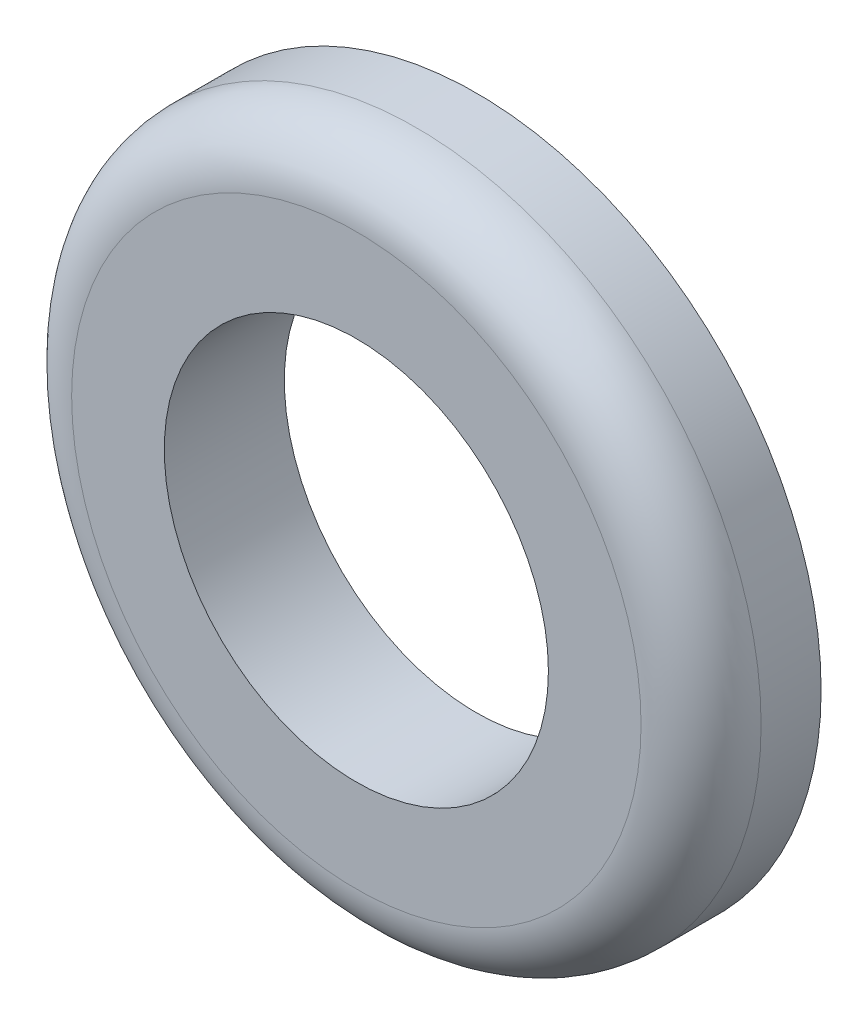
ISO-10303-21;
HEADER;
FILE_DESCRIPTION(('STEP AP214'),'2;1');
FILE_NAME('part.step','',(''),(''),'','','');
FILE_SCHEMA(('AUTOMOTIVE_DESIGN { 1 0 10303 214 1 1 1 1 }'));
ENDSEC;
DATA;
#1=APPLICATION_CONTEXT('core data for automotive mechanical design processes');
#2=APPLICATION_PROTOCOL_DEFINITION('international standard','automotive_design',2000,#1);
#3=PRODUCT_CONTEXT('',#1,'mechanical');
#4=PRODUCT('Part','Part','',(#3));
#5=PRODUCT_RELATED_PRODUCT_CATEGORY('part','',(#4));
#6=PRODUCT_DEFINITION_FORMATION('','',#4);
#7=PRODUCT_DEFINITION_CONTEXT('part definition',#1,'design');
#8=PRODUCT_DEFINITION('design','',#6,#7);
#9=PRODUCT_DEFINITION_SHAPE('','',#8);
#10=(LENGTH_UNIT() NAMED_UNIT(*) SI_UNIT(.MILLI.,.METRE.));
#11=(NAMED_UNIT(*) PLANE_ANGLE_UNIT() SI_UNIT($,.RADIAN.));
#12=(NAMED_UNIT(*) SI_UNIT($,.STERADIAN.) SOLID_ANGLE_UNIT());
#13=UNCERTAINTY_MEASURE_WITH_UNIT(LENGTH_MEASURE(1.E-05),#10,'distance_accuracy_value','');
#14=(GEOMETRIC_REPRESENTATION_CONTEXT(3) GLOBAL_UNCERTAINTY_ASSIGNED_CONTEXT((#13)) GLOBAL_UNIT_ASSIGNED_CONTEXT((#10,
#11,#12)) REPRESENTATION_CONTEXT('',''));
#15=CARTESIAN_POINT('',(0.,0.,0.));
#16=DIRECTION('',(0.,0.,1.));
#17=DIRECTION('',(1.,0.,0.));
#18=AXIS2_PLACEMENT_3D('',#15,#16,#17);
#19=CARTESIAN_POINT('',(0.,0.,1.));
#20=DIRECTION('',(0.,0.,1.));
#21=DIRECTION('',(1.,0.,0.));
#22=AXIS2_PLACEMENT_3D('',#19,#20,#21);
#23=PLANE('',#22);
#24=CARTESIAN_POINT('',(0.,0.,1.));
#25=DIRECTION('',(0.,0.,1.));
#26=DIRECTION('',(1.,0.,0.));
#27=AXIS2_PLACEMENT_3D('',#24,#25,#26);
#28=CIRCLE('',#27,2.37179487179487);
#29=CARTESIAN_POINT('',(2.37179487179487,0.,1.));
#30=VERTEX_POINT('',#29);
#31=EDGE_CURVE('E37',#30,#30,#28,.T.);
#32=ORIENTED_EDGE('',*,*,#31,.T.);
#33=EDGE_LOOP('',(#32));
#34=FACE_BOUND('',#33,.T.);
#35=CARTESIAN_POINT('',(0.,0.,1.));
#36=DIRECTION('',(0.,0.,1.));
#37=DIRECTION('',(1.,0.,0.));
#38=AXIS2_PLACEMENT_3D('',#35,#36,#37);
#39=CIRCLE('',#38,1.6);
#40=CARTESIAN_POINT('',(1.6,0.,1.));
#41=VERTEX_POINT('',#40);
#42=EDGE_CURVE('E45',#41,#41,#39,.T.);
#43=ORIENTED_EDGE('',*,*,#42,.F.);
#44=EDGE_LOOP('',(#43));
#45=FACE_BOUND('',#44,.T.);
#46=ADVANCED_FACE('F30',(#34,#45),#23,.T.);
#47=CARTESIAN_POINT('',(0.,0.,0.));
#48=DIRECTION('',(0.,0.,1.));
#49=DIRECTION('',(1.,0.,0.));
#50=AXIS2_PLACEMENT_3D('',#47,#48,#49);
#51=PLANE('',#50);
#52=CARTESIAN_POINT('',(0.,0.,0.));
#53=DIRECTION('',(0.,0.,1.));
#54=DIRECTION('',(1.,0.,0.));
#55=AXIS2_PLACEMENT_3D('',#52,#53,#54);
#56=CIRCLE('',#55,2.87179487179487);
#57=CARTESIAN_POINT('',(2.87179487179487,0.,0.));
#58=VERTEX_POINT('',#57);
#59=EDGE_CURVE('E41',#58,#58,#56,.T.);
#60=ORIENTED_EDGE('',*,*,#59,.F.);
#61=EDGE_LOOP('',(#60));
#62=FACE_BOUND('',#61,.T.);
#63=CARTESIAN_POINT('',(0.,0.,0.));
#64=DIRECTION('',(0.,0.,1.));
#65=DIRECTION('',(1.,0.,0.));
#66=AXIS2_PLACEMENT_3D('',#63,#64,#65);
#67=CIRCLE('',#66,1.6);
#68=CARTESIAN_POINT('',(1.6,0.,0.));
#69=VERTEX_POINT('',#68);
#70=EDGE_CURVE('E48',#69,#69,#67,.T.);
#71=ORIENTED_EDGE('',*,*,#70,.T.);
#72=EDGE_LOOP('',(#71));
#73=FACE_BOUND('',#72,.T.);
#74=ADVANCED_FACE('F58',(#62,#73),#51,.F.);
#75=CARTESIAN_POINT('',(0.,0.,1.));
#76=DIRECTION('',(0.,0.,-1.));
#77=DIRECTION('',(-1.,0.,0.));
#78=AXIS2_PLACEMENT_3D('',#75,#76,#77);
#79=CYLINDRICAL_SURFACE('',#78,2.87179487179487);
#80=CARTESIAN_POINT('',(0.,0.,0.5));
#81=DIRECTION('',(0.,0.,1.));
#82=DIRECTION('',(1.,0.,0.));
#83=AXIS2_PLACEMENT_3D('',#80,#81,#82);
#84=CIRCLE('',#83,2.87179487179487);
#85=CARTESIAN_POINT('',(2.87179487179487,0.,0.5));
#86=VERTEX_POINT('',#85);
#87=EDGE_CURVE('E10',#86,#86,#84,.F.);
#88=ORIENTED_EDGE('',*,*,#87,.T.);
#89=EDGE_LOOP('',(#88));
#90=FACE_BOUND('',#89,.T.);
#91=ORIENTED_EDGE('',*,*,#59,.T.);
#92=EDGE_LOOP('',(#91));
#93=FACE_BOUND('',#92,.T.);
#94=ADVANCED_FACE('F63',(#90,#93),#79,.T.);
#95=CARTESIAN_POINT('',(0.,0.,1.));
#96=DIRECTION('',(0.,0.,-1.));
#97=DIRECTION('',(-1.,0.,0.));
#98=AXIS2_PLACEMENT_3D('',#95,#96,#97);
#99=CYLINDRICAL_SURFACE('',#98,1.6);
#100=ORIENTED_EDGE('',*,*,#42,.T.);
#101=EDGE_LOOP('',(#100));
#102=FACE_BOUND('',#101,.T.);
#103=ORIENTED_EDGE('',*,*,#70,.F.);
#104=EDGE_LOOP('',(#103));
#105=FACE_BOUND('',#104,.T.);
#106=ADVANCED_FACE('F54',(#102,#105),#99,.F.);
#107=CARTESIAN_POINT('',(0.,0.,0.5));
#108=DIRECTION('',(0.,0.,1.));
#109=DIRECTION('',(1.,0.,0.));
#110=AXIS2_PLACEMENT_3D('',#107,#108,#109);
#111=TOROIDAL_SURFACE('',#110,2.37179487179487,0.5);
#112=ORIENTED_EDGE('',*,*,#87,.F.);
#113=EDGE_LOOP('',(#112));
#114=FACE_BOUND('',#113,.T.);
#115=ORIENTED_EDGE('',*,*,#31,.F.);
#116=EDGE_LOOP('',(#115));
#117=FACE_BOUND('',#116,.T.);
#118=ADVANCED_FACE('F32',(#114,#117),#111,.T.);
#119=CLOSED_SHELL('',(#46,#74,#94,#106,#118));
#120=MANIFOLD_SOLID_BREP('B2',#119);
#121=ADVANCED_BREP_SHAPE_REPRESENTATION('',(#18,#120),#14);
#122=SHAPE_DEFINITION_REPRESENTATION(#9,#121);
ENDSEC;
END-ISO-10303-21;
